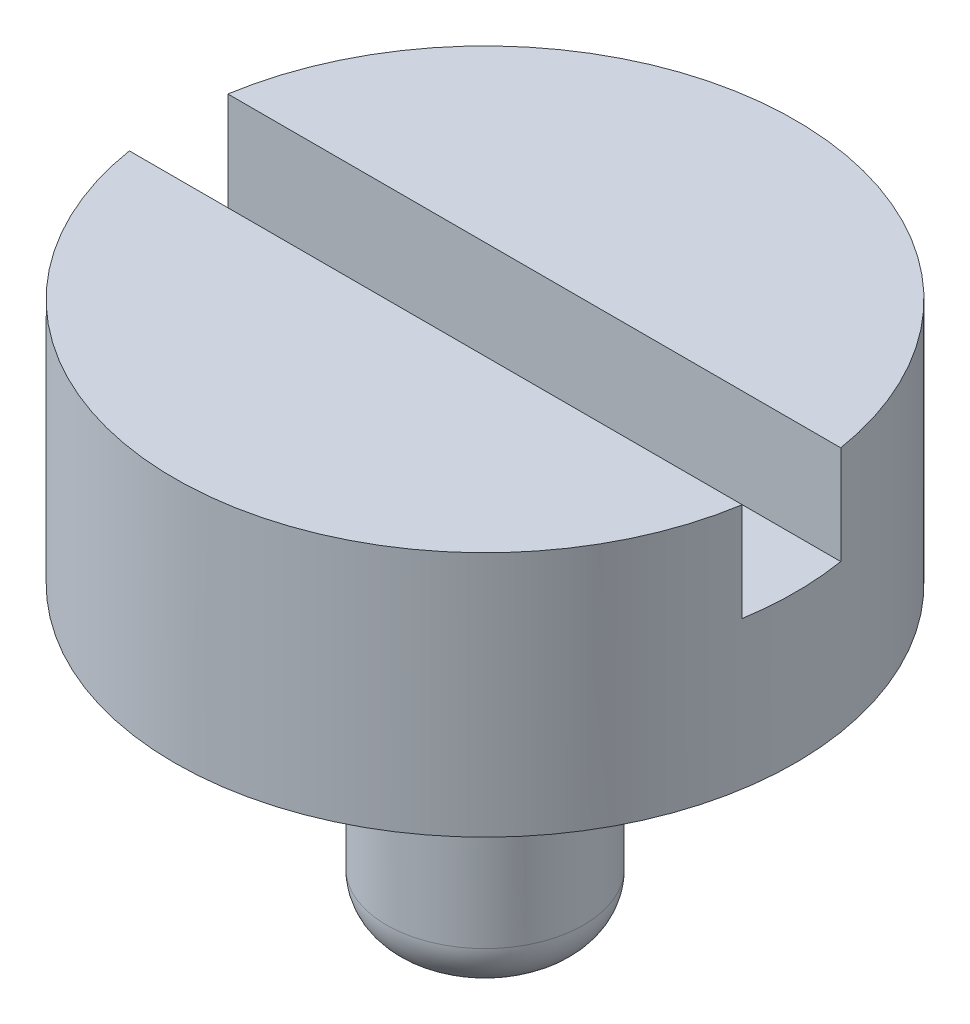
ISO-10303-21;
HEADER;
FILE_DESCRIPTION(('STEP AP214'),'2;1');
FILE_NAME('part.step','',(''),(''),'','','');
FILE_SCHEMA(('AUTOMOTIVE_DESIGN { 1 0 10303 214 1 1 1 1 }'));
ENDSEC;
DATA;
#1=APPLICATION_CONTEXT('core data for automotive mechanical design processes');
#2=APPLICATION_PROTOCOL_DEFINITION('international standard','automotive_design',2000,#1);
#3=PRODUCT_CONTEXT('',#1,'mechanical');
#4=PRODUCT('Part','Part','',(#3));
#5=PRODUCT_RELATED_PRODUCT_CATEGORY('part','',(#4));
#6=PRODUCT_DEFINITION_FORMATION('','',#4);
#7=PRODUCT_DEFINITION_CONTEXT('part definition',#1,'design');
#8=PRODUCT_DEFINITION('design','',#6,#7);
#9=PRODUCT_DEFINITION_SHAPE('','',#8);
#10=(LENGTH_UNIT() NAMED_UNIT(*) SI_UNIT(.MILLI.,.METRE.));
#11=(NAMED_UNIT(*) PLANE_ANGLE_UNIT() SI_UNIT($,.RADIAN.));
#12=(NAMED_UNIT(*) SI_UNIT($,.STERADIAN.) SOLID_ANGLE_UNIT());
#13=UNCERTAINTY_MEASURE_WITH_UNIT(LENGTH_MEASURE(1.E-05),#10,'distance_accuracy_value','');
#14=(GEOMETRIC_REPRESENTATION_CONTEXT(3) GLOBAL_UNCERTAINTY_ASSIGNED_CONTEXT((#13)) GLOBAL_UNIT_ASSIGNED_CONTEXT((#10,
#11,#12)) REPRESENTATION_CONTEXT('',''));
#15=CARTESIAN_POINT('',(0.,0.,0.));
#16=DIRECTION('',(0.,0.,1.));
#17=DIRECTION('',(1.,0.,0.));
#18=AXIS2_PLACEMENT_3D('',#15,#16,#17);
#19=CARTESIAN_POINT('',(0.,13.97,0.));
#20=DIRECTION('',(0.,1.,0.));
#21=DIRECTION('',(0.,0.,1.));
#22=AXIS2_PLACEMENT_3D('',#19,#20,#21);
#23=PLANE('',#22);
#24=CARTESIAN_POINT('',(0.,13.97,0.));
#25=DIRECTION('',(0.,1.,0.));
#26=DIRECTION('',(0.,0.,1.));
#27=AXIS2_PLACEMENT_3D('',#24,#25,#26);
#28=CIRCLE('',#27,8.001);
#29=CARTESIAN_POINT('',(-7.89956334236266,13.97,1.27));
#30=VERTEX_POINT('',#29);
#31=CARTESIAN_POINT('',(7.89956334236266,13.97,1.27));
#32=VERTEX_POINT('',#31);
#33=EDGE_CURVE('E87',#30,#32,#28,.T.);
#34=ORIENTED_EDGE('',*,*,#33,.T.);
#35=DIRECTION('',(-1.,0.,0.));
#36=VECTOR('',#35,1.);
#37=CARTESIAN_POINT('',(0.,13.97,1.27));
#38=LINE('',#37,#36);
#39=EDGE_CURVE('E71',#32,#30,#38,.T.);
#40=ORIENTED_EDGE('',*,*,#39,.T.);
#41=EDGE_LOOP('',(#34,#40));
#42=FACE_BOUND('',#41,.T.);
#43=ADVANCED_FACE('F32',(#42),#23,.T.);
#44=CARTESIAN_POINT('',(0.,7.62,0.));
#45=DIRECTION('',(0.,-1.,0.));
#46=DIRECTION('',(0.,0.,-1.));
#47=AXIS2_PLACEMENT_3D('',#44,#45,#46);
#48=CYLINDRICAL_SURFACE('',#47,2.54);
#49=CARTESIAN_POINT('',(0.,1.27,0.));
#50=DIRECTION('',(0.,1.,0.));
#51=DIRECTION('',(0.,0.,1.));
#52=AXIS2_PLACEMENT_3D('',#49,#50,#51);
#53=CIRCLE('',#52,2.54);
#54=CARTESIAN_POINT('',(0.,1.27,-2.54));
#55=VERTEX_POINT('',#54);
#56=EDGE_CURVE('E102',#55,#55,#53,.T.);
#57=CARTESIAN_POINT('',(0.,7.62,0.));
#58=DIRECTION('',(0.,1.,0.));
#59=DIRECTION('',(0.,0.,1.));
#60=AXIS2_PLACEMENT_3D('',#57,#58,#59);
#61=CIRCLE('',#60,2.54);
#62=CARTESIAN_POINT('',(0.,7.62,-2.54));
#63=VERTEX_POINT('',#62);
#64=EDGE_CURVE('E94',#63,#63,#61,.T.);
#65=CARTESIAN_POINT('',(0.,1.27,-2.54));
#66=CARTESIAN_POINT('',(0.,1.33614583333333,-2.54));
#67=CARTESIAN_POINT('',(0.,1.40229166666667,-2.54));
#68=CARTESIAN_POINT('',(0.,1.53458333333333,-2.54));
#69=CARTESIAN_POINT('',(0.,1.60072916666666,-2.54));
#70=CARTESIAN_POINT('',(0.,1.73302083333333,-2.54));
#71=CARTESIAN_POINT('',(0.,1.79916666666667,-2.54));
#72=CARTESIAN_POINT('',(0.,1.93145833333333,-2.54));
#73=CARTESIAN_POINT('',(0.,1.99760416666667,-2.54));
#74=CARTESIAN_POINT('',(0.,2.12989583333333,-2.54));
#75=CARTESIAN_POINT('',(0.,2.19604166666667,-2.54));
#76=CARTESIAN_POINT('',(0.,2.32833333333333,-2.54));
#77=CARTESIAN_POINT('',(0.,2.39447916666667,-2.54));
#78=CARTESIAN_POINT('',(0.,2.52677083333333,-2.54));
#79=CARTESIAN_POINT('',(0.,2.59291666666667,-2.54));
#80=CARTESIAN_POINT('',(0.,2.72520833333333,-2.54));
#81=CARTESIAN_POINT('',(0.,2.79135416666667,-2.54));
#82=CARTESIAN_POINT('',(0.,2.92364583333333,-2.54));
#83=CARTESIAN_POINT('',(0.,2.98979166666667,-2.54));
#84=CARTESIAN_POINT('',(0.,3.12208333333333,-2.54));
#85=CARTESIAN_POINT('',(0.,3.18822916666667,-2.54));
#86=CARTESIAN_POINT('',(0.,3.32052083333333,-2.54));
#87=CARTESIAN_POINT('',(0.,3.38666666666667,-2.54));
#88=CARTESIAN_POINT('',(0.,3.51895833333333,-2.54));
#89=CARTESIAN_POINT('',(0.,3.58510416666667,-2.54));
#90=CARTESIAN_POINT('',(0.,3.71739583333333,-2.54));
#91=CARTESIAN_POINT('',(0.,3.78354166666667,-2.54));
#92=CARTESIAN_POINT('',(0.,3.91583333333333,-2.54));
#93=CARTESIAN_POINT('',(0.,3.98197916666666,-2.54));
#94=CARTESIAN_POINT('',(0.,4.11427083333333,-2.54));
#95=CARTESIAN_POINT('',(0.,4.18041666666667,-2.54));
#96=CARTESIAN_POINT('',(0.,4.31270833333333,-2.54));
#97=CARTESIAN_POINT('',(0.,4.37885416666667,-2.54));
#98=CARTESIAN_POINT('',(0.,4.51114583333333,-2.54));
#99=CARTESIAN_POINT('',(0.,4.57729166666667,-2.54));
#100=CARTESIAN_POINT('',(0.,4.70958333333333,-2.54));
#101=CARTESIAN_POINT('',(0.,4.77572916666667,-2.54));
#102=CARTESIAN_POINT('',(0.,4.90802083333333,-2.54));
#103=CARTESIAN_POINT('',(0.,4.97416666666667,-2.54));
#104=CARTESIAN_POINT('',(0.,5.10645833333333,-2.54));
#105=CARTESIAN_POINT('',(0.,5.17260416666667,-2.54));
#106=CARTESIAN_POINT('',(0.,5.30489583333333,-2.54));
#107=CARTESIAN_POINT('',(0.,5.37104166666667,-2.54));
#108=CARTESIAN_POINT('',(0.,5.50333333333333,-2.54));
#109=CARTESIAN_POINT('',(0.,5.56947916666667,-2.54));
#110=CARTESIAN_POINT('',(0.,5.70177083333333,-2.54));
#111=CARTESIAN_POINT('',(0.,5.76791666666667,-2.54));
#112=CARTESIAN_POINT('',(0.,5.90020833333333,-2.54));
#113=CARTESIAN_POINT('',(0.,5.96635416666667,-2.54));
#114=CARTESIAN_POINT('',(0.,6.09864583333333,-2.54));
#115=CARTESIAN_POINT('',(0.,6.16479166666667,-2.54));
#116=CARTESIAN_POINT('',(0.,6.29708333333333,-2.54));
#117=CARTESIAN_POINT('',(0.,6.36322916666667,-2.54));
#118=CARTESIAN_POINT('',(0.,6.49552083333333,-2.54));
#119=CARTESIAN_POINT('',(0.,6.56166666666667,-2.54));
#120=CARTESIAN_POINT('',(0.,6.69395833333333,-2.54));
#121=CARTESIAN_POINT('',(0.,6.76010416666667,-2.54));
#122=CARTESIAN_POINT('',(0.,6.89239583333333,-2.54));
#123=CARTESIAN_POINT('',(0.,6.95854166666667,-2.54));
#124=CARTESIAN_POINT('',(0.,7.09083333333333,-2.54));
#125=CARTESIAN_POINT('',(0.,7.15697916666667,-2.54));
#126=CARTESIAN_POINT('',(0.,7.28927083333333,-2.54));
#127=CARTESIAN_POINT('',(0.,7.35541666666667,-2.54));
#128=CARTESIAN_POINT('',(0.,7.48770833333333,-2.54));
#129=CARTESIAN_POINT('',(0.,7.55385416666667,-2.54));
#130=CARTESIAN_POINT('',(0.,7.62,-2.54));
#131=B_SPLINE_CURVE_WITH_KNOTS('',3,(#65,#66,#67,#68,#69,#70,#71,#72,#73,#74,#75,#76,#77,#78,
#79,#80,#81,#82,#83,#84,#85,#86,#87,#88,#89,#90,#91,#92,#93,#94,#95,#96,#97,#98,#99,#100,#101,
#102,#103,#104,#105,#106,#107,#108,#109,#110,#111,#112,#113,#114,#115,#116,#117,#118,#119,#120,
#121,#122,#123,#124,#125,#126,#127,#128,#129,#130),.UNSPECIFIED.,.F.,.F.,(4,2,2,2,2,2,2,2,2,2,2,
2,2,2,2,2,2,2,2,2,2,2,2,2,2,2,2,2,2,2,2,2,4),(0.,0.1984375,0.396875,0.5953125,0.79375,0.9921875,
1.190625,1.3890625,1.5875,1.7859375,1.984375,2.1828125,2.38125,2.5796875,2.778125,2.9765625,
3.175,3.3734375,3.571875,3.7703125,3.96875,4.1671875,4.365625,4.5640625,4.7625,4.9609375,
5.159375,5.3578125,5.55625,5.7546875,5.953125,6.1515625,6.35),.UNSPECIFIED.);
#132=EDGE_CURVE('BSEAM131',#55,#63,#131,.T.);
#133=ORIENTED_EDGE('',*,*,#56,.T.);
#134=ORIENTED_EDGE('',*,*,#64,.F.);
#135=ORIENTED_EDGE('',*,*,#132,.T.);
#136=ORIENTED_EDGE('',*,*,#132,.F.);
#137=EDGE_LOOP('',(#133,#135,#134,#136));
#138=FACE_BOUND('',#137,.T.);
#139=ADVANCED_FACE('F131',(#138),#48,.T.);
#140=CARTESIAN_POINT('',(0.,0.,0.));
#141=DIRECTION('',(0.,1.,0.));
#142=DIRECTION('',(0.,0.,1.));
#143=AXIS2_PLACEMENT_3D('',#140,#141,#142);
#144=PLANE('',#143);
#145=CARTESIAN_POINT('',(0.,0.,0.));
#146=DIRECTION('',(0.,1.,0.));
#147=DIRECTION('',(0.,0.,1.));
#148=AXIS2_PLACEMENT_3D('',#145,#146,#147);
#149=CIRCLE('',#148,1.27);
#150=CARTESIAN_POINT('',(0.,0.,1.27));
#151=VERTEX_POINT('',#150);
#152=EDGE_CURVE('E80',#151,#151,#149,.F.);
#153=ORIENTED_EDGE('',*,*,#152,.T.);
#154=EDGE_LOOP('',(#153));
#155=FACE_BOUND('',#154,.T.);
#156=ADVANCED_FACE('F127',(#155),#144,.F.);
#157=CARTESIAN_POINT('',(0.,13.97,0.));
#158=DIRECTION('',(0.,-1.,0.));
#159=DIRECTION('',(0.,0.,-1.));
#160=AXIS2_PLACEMENT_3D('',#157,#158,#159);
#161=CYLINDRICAL_SURFACE('',#160,8.001);
#162=CARTESIAN_POINT('',(7.89956334236266,13.97,-1.27));
#163=VERTEX_POINT('',#162);
#164=CARTESIAN_POINT('',(-7.89956334236266,13.97,-1.27));
#165=VERTEX_POINT('',#164);
#166=EDGE_CURVE('E90',#163,#165,#28,.T.);
#167=ORIENTED_EDGE('',*,*,#166,.F.);
#168=DIRECTION('',(0.,-1.,0.));
#169=VECTOR('',#168,1.);
#170=CARTESIAN_POINT('',(7.89956334236266,13.97,-1.27));
#171=LINE('',#170,#169);
#172=CARTESIAN_POINT('',(7.89956334236266,11.43,-1.27));
#173=VERTEX_POINT('',#172);
#174=EDGE_CURVE('E55',#163,#173,#171,.T.);
#175=ORIENTED_EDGE('',*,*,#174,.T.);
#176=CARTESIAN_POINT('',(0.,11.43,0.));
#177=DIRECTION('',(0.,1.,0.));
#178=DIRECTION('',(0.,0.,1.));
#179=AXIS2_PLACEMENT_3D('',#176,#177,#178);
#180=CIRCLE('',#179,8.001);
#181=CARTESIAN_POINT('',(7.89956334236266,11.43,1.27));
#182=VERTEX_POINT('',#181);
#183=EDGE_CURVE('E11',#182,#173,#180,.T.);
#184=ORIENTED_EDGE('',*,*,#183,.F.);
#185=DIRECTION('',(0.,-1.,0.));
#186=VECTOR('',#185,1.);
#187=CARTESIAN_POINT('',(7.89956334236266,13.97,1.27));
#188=LINE('',#187,#186);
#189=EDGE_CURVE('E74',#32,#182,#188,.T.);
#190=ORIENTED_EDGE('',*,*,#189,.F.);
#191=ORIENTED_EDGE('',*,*,#33,.F.);
#192=DIRECTION('',(0.,-1.,0.));
#193=VECTOR('',#192,1.);
#194=CARTESIAN_POINT('',(-7.89956334236266,13.97,1.27));
#195=LINE('',#194,#193);
#196=CARTESIAN_POINT('',(-7.89956334236266,11.43,1.27));
#197=VERTEX_POINT('',#196);
#198=EDGE_CURVE('E47',#197,#30,#195,.F.);
#199=ORIENTED_EDGE('',*,*,#198,.F.);
#200=CARTESIAN_POINT('',(-7.89956334236266,11.43,-1.27));
#201=VERTEX_POINT('',#200);
#202=EDGE_CURVE('E36',#201,#197,#180,.T.);
#203=ORIENTED_EDGE('',*,*,#202,.F.);
#204=DIRECTION('',(0.,-1.,0.));
#205=VECTOR('',#204,1.);
#206=CARTESIAN_POINT('',(-7.89956334236266,13.97,-1.27));
#207=LINE('',#206,#205);
#208=EDGE_CURVE('E88',#201,#165,#207,.F.);
#209=ORIENTED_EDGE('',*,*,#208,.T.);
#210=EDGE_LOOP('',(#167,#175,#184,#190,#191,#199,#203,#209));
#211=FACE_BOUND('',#210,.T.);
#212=CARTESIAN_POINT('',(0.,7.62,0.));
#213=DIRECTION('',(0.,1.,0.));
#214=DIRECTION('',(0.,0.,1.));
#215=AXIS2_PLACEMENT_3D('',#212,#213,#214);
#216=CIRCLE('',#215,8.001);
#217=CARTESIAN_POINT('',(0.,7.62,8.001));
#218=VERTEX_POINT('',#217);
#219=EDGE_CURVE('E91',#218,#218,#216,.T.);
#220=ORIENTED_EDGE('',*,*,#219,.T.);
#221=EDGE_LOOP('',(#220));
#222=FACE_BOUND('',#221,.T.);
#223=ADVANCED_FACE('F85',(#211,#222),#161,.T.);
#224=DIRECTION('',(-1.,0.,0.));
#225=VECTOR('',#224,1.);
#226=CARTESIAN_POINT('',(0.,13.97,-1.27));
#227=LINE('',#226,#225);
#228=EDGE_CURVE('E79',#163,#165,#227,.T.);
#229=ORIENTED_EDGE('',*,*,#228,.F.);
#230=ORIENTED_EDGE('',*,*,#166,.T.);
#231=EDGE_LOOP('',(#229,#230));
#232=FACE_BOUND('',#231,.T.);
#233=ADVANCED_FACE('F117',(#232),#23,.T.);
#234=CARTESIAN_POINT('',(0.,7.62,0.));
#235=DIRECTION('',(0.,1.,0.));
#236=DIRECTION('',(0.,0.,1.));
#237=AXIS2_PLACEMENT_3D('',#234,#235,#236);
#238=PLANE('',#237);
#239=ORIENTED_EDGE('',*,*,#64,.T.);
#240=EDGE_LOOP('',(#239));
#241=FACE_BOUND('',#240,.T.);
#242=ORIENTED_EDGE('',*,*,#219,.F.);
#243=EDGE_LOOP('',(#242));
#244=FACE_BOUND('',#243,.T.);
#245=ADVANCED_FACE('F119',(#241,#244),#238,.F.);
#246=CARTESIAN_POINT('',(0.,1.27,0.));
#247=DIRECTION('',(0.,1.,0.));
#248=DIRECTION('',(0.,0.,1.));
#249=AXIS2_PLACEMENT_3D('',#246,#247,#248);
#250=DEGENERATE_TOROIDAL_SURFACE('',#249,1.27,1.27,.T.);
#251=ORIENTED_EDGE('',*,*,#152,.F.);
#252=EDGE_LOOP('',(#251));
#253=FACE_BOUND('',#252,.T.);
#254=ORIENTED_EDGE('',*,*,#56,.F.);
#255=EDGE_LOOP('',(#254));
#256=FACE_BOUND('',#255,.T.);
#257=ADVANCED_FACE('F34',(#253,#256),#250,.T.);
#258=CARTESIAN_POINT('',(-63.5,11.43,-1.27));
#259=DIRECTION('',(0.,1.,0.));
#260=DIRECTION('',(0.,0.,1.));
#261=AXIS2_PLACEMENT_3D('',#258,#259,#260);
#262=PLANE('',#261);
#263=ORIENTED_EDGE('',*,*,#183,.T.);
#264=DIRECTION('',(1.,0.,0.));
#265=VECTOR('',#264,1.);
#266=CARTESIAN_POINT('',(-63.5,11.43,-1.27));
#267=LINE('',#266,#265);
#268=EDGE_CURVE('E112',#201,#173,#267,.T.);
#269=ORIENTED_EDGE('',*,*,#268,.F.);
#270=ORIENTED_EDGE('',*,*,#202,.T.);
#271=DIRECTION('',(1.,0.,0.));
#272=VECTOR('',#271,1.);
#273=CARTESIAN_POINT('',(-63.5,11.43,1.27));
#274=LINE('',#273,#272);
#275=EDGE_CURVE('E111',#197,#182,#274,.T.);
#276=ORIENTED_EDGE('',*,*,#275,.T.);
#277=EDGE_LOOP('',(#263,#269,#270,#276));
#278=FACE_BOUND('',#277,.T.);
#279=ADVANCED_FACE('F110',(#278),#262,.T.);
#280=CARTESIAN_POINT('',(-63.5,11.43,-1.27));
#281=DIRECTION('',(0.,0.,-1.));
#282=DIRECTION('',(-1.,0.,0.));
#283=AXIS2_PLACEMENT_3D('',#280,#281,#282);
#284=PLANE('',#283);
#285=ORIENTED_EDGE('',*,*,#228,.T.);
#286=ORIENTED_EDGE('',*,*,#208,.F.);
#287=ORIENTED_EDGE('',*,*,#268,.T.);
#288=ORIENTED_EDGE('',*,*,#174,.F.);
#289=EDGE_LOOP('',(#285,#286,#287,#288));
#290=FACE_BOUND('',#289,.T.);
#291=ADVANCED_FACE('F152',(#290),#284,.F.);
#292=CARTESIAN_POINT('',(-63.5,11.43,1.27));
#293=DIRECTION('',(0.,0.,-1.));
#294=DIRECTION('',(-1.,0.,0.));
#295=AXIS2_PLACEMENT_3D('',#292,#293,#294);
#296=PLANE('',#295);
#297=ORIENTED_EDGE('',*,*,#189,.T.);
#298=ORIENTED_EDGE('',*,*,#275,.F.);
#299=ORIENTED_EDGE('',*,*,#198,.T.);
#300=ORIENTED_EDGE('',*,*,#39,.F.);
#301=EDGE_LOOP('',(#297,#298,#299,#300));
#302=FACE_BOUND('',#301,.T.);
#303=ADVANCED_FACE('F73',(#302),#296,.T.);
#304=CLOSED_SHELL('',(#43,#139,#156,#223,#233,#245,#257,#279,#291,#303));
#305=MANIFOLD_SOLID_BREP('B2',#304);
#306=ADVANCED_BREP_SHAPE_REPRESENTATION('',(#18,#305),#14);
#307=SHAPE_DEFINITION_REPRESENTATION(#9,#306);
ENDSEC;
END-ISO-10303-21;
